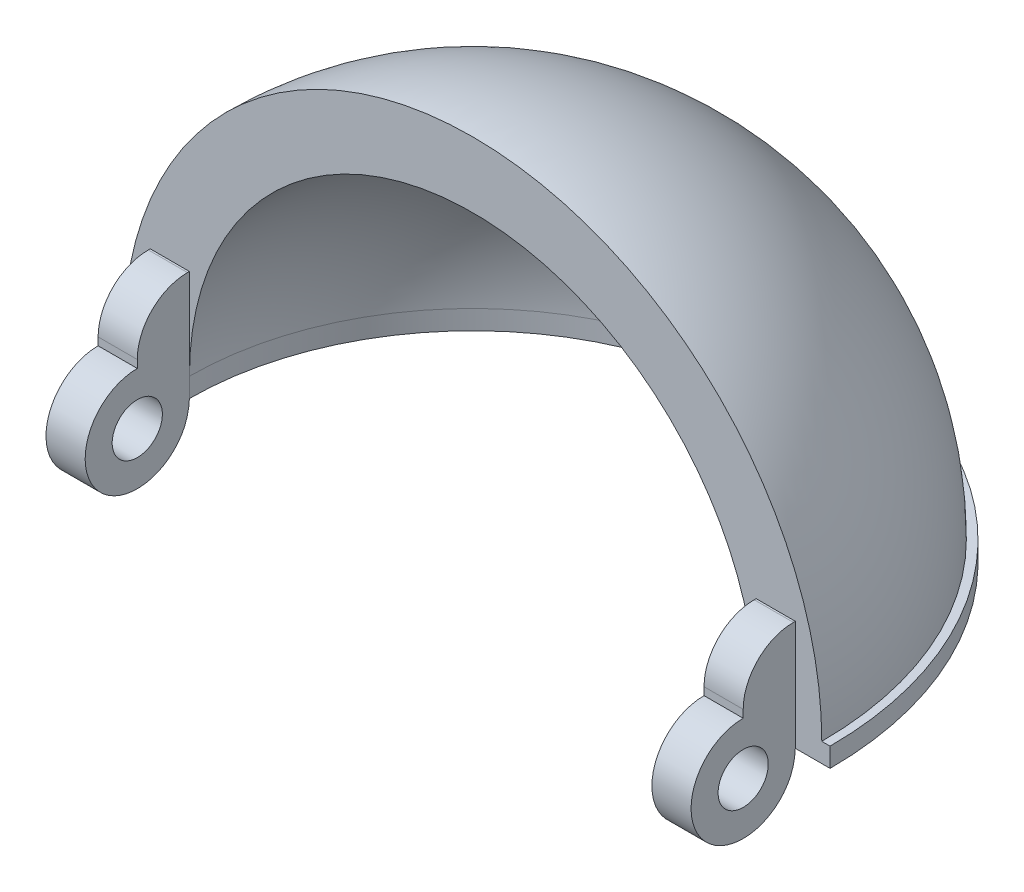
ISO-10303-21;
HEADER;
FILE_DESCRIPTION(('STEP AP214'),'2;1');
FILE_NAME('part.step','',(''),(''),'','','');
FILE_SCHEMA(('AUTOMOTIVE_DESIGN { 1 0 10303 214 1 1 1 1 }'));
ENDSEC;
DATA;
#1=APPLICATION_CONTEXT('core data for automotive mechanical design processes');
#2=APPLICATION_PROTOCOL_DEFINITION('international standard','automotive_design',2000,#1);
#3=PRODUCT_CONTEXT('',#1,'mechanical');
#4=PRODUCT('Part','Part','',(#3));
#5=PRODUCT_RELATED_PRODUCT_CATEGORY('part','',(#4));
#6=PRODUCT_DEFINITION_FORMATION('','',#4);
#7=PRODUCT_DEFINITION_CONTEXT('part definition',#1,'design');
#8=PRODUCT_DEFINITION('design','',#6,#7);
#9=PRODUCT_DEFINITION_SHAPE('','',#8);
#10=(LENGTH_UNIT() NAMED_UNIT(*) SI_UNIT(.MILLI.,.METRE.));
#11=(NAMED_UNIT(*) PLANE_ANGLE_UNIT() SI_UNIT($,.RADIAN.));
#12=(NAMED_UNIT(*) SI_UNIT($,.STERADIAN.) SOLID_ANGLE_UNIT());
#13=UNCERTAINTY_MEASURE_WITH_UNIT(LENGTH_MEASURE(1.E-05),#10,'distance_accuracy_value','');
#14=(GEOMETRIC_REPRESENTATION_CONTEXT(3) GLOBAL_UNCERTAINTY_ASSIGNED_CONTEXT((#13)) GLOBAL_UNIT_ASSIGNED_CONTEXT((#10,
#11,#12)) REPRESENTATION_CONTEXT('',''));
#15=CARTESIAN_POINT('',(0.,0.,0.));
#16=DIRECTION('',(0.,0.,1.));
#17=DIRECTION('',(1.,0.,0.));
#18=AXIS2_PLACEMENT_3D('',#15,#16,#17);
#19=CARTESIAN_POINT('',(-16.1602681796989,3.93657637130622,0.126576371306225));
#20=DIRECTION('',(1.,0.,0.));
#21=DIRECTION('',(0.,0.,-1.));
#22=AXIS2_PLACEMENT_3D('',#19,#20,#21);
#23=CYLINDRICAL_SURFACE('',#22,3.302);
#24=DIRECTION('',(-1.,0.,0.));
#25=VECTOR('',#24,1.);
#26=CARTESIAN_POINT('',(-16.1602681796989,3.93657637130622,3.42857637130622));
#27=LINE('',#26,#25);
#28=CARTESIAN_POINT('',(-13.5836555670863,3.93657637130622,3.42857637130622));
#29=VERTEX_POINT('',#28);
#30=CARTESIAN_POINT('',(-16.1602681796989,3.93657637130622,3.42857637130622));
#31=VERTEX_POINT('',#30);
#32=EDGE_CURVE('E258',#29,#31,#27,.T.);
#33=ORIENTED_EDGE('',*,*,#32,.F.);
#34=CARTESIAN_POINT('',(-13.5836555670863,3.93657637130622,0.126576371306225));
#35=DIRECTION('',(1.,0.,0.));
#36=DIRECTION('',(0.,0.,-1.));
#37=AXIS2_PLACEMENT_3D('',#34,#35,#36);
#38=CIRCLE('',#37,3.302);
#39=CARTESIAN_POINT('',(-13.5836555670863,7.23857637130622,0.126576371306224));
#40=VERTEX_POINT('',#39);
#41=EDGE_CURVE('E42',#40,#29,#38,.T.);
#42=ORIENTED_EDGE('',*,*,#41,.F.);
#43=DIRECTION('',(-1.,0.,0.));
#44=VECTOR('',#43,1.);
#45=CARTESIAN_POINT('',(-16.1602681796989,7.23857637130622,0.126576371306225));
#46=LINE('',#45,#44);
#47=CARTESIAN_POINT('',(-16.1602681796989,7.23857637130622,0.126576371306224));
#48=VERTEX_POINT('',#47);
#49=EDGE_CURVE('E260',#48,#40,#46,.F.);
#50=ORIENTED_EDGE('',*,*,#49,.F.);
#51=CARTESIAN_POINT('',(-16.1602681796989,3.93657637130622,0.126576371306225));
#52=DIRECTION('',(1.,0.,0.));
#53=DIRECTION('',(0.,0.,-1.));
#54=AXIS2_PLACEMENT_3D('',#51,#52,#53);
#55=CIRCLE('',#54,3.302);
#56=EDGE_CURVE('E11',#31,#48,#55,.F.);
#57=ORIENTED_EDGE('',*,*,#56,.F.);
#58=EDGE_LOOP('',(#33,#42,#50,#57));
#59=FACE_BOUND('',#58,.T.);
#60=ADVANCED_FACE('F35',(#59),#23,.T.);
#61=CARTESIAN_POINT('',(0.,3.93657637130622,0.126576371306225));
#62=DIRECTION('',(-1.,0.,0.));
#63=DIRECTION('',(0.,0.,1.));
#64=AXIS2_PLACEMENT_3D('',#61,#62,#63);
#65=CYLINDRICAL_SURFACE('',#64,3.302);
#66=DIRECTION('',(1.,0.,0.));
#67=VECTOR('',#66,1.);
#68=CARTESIAN_POINT('',(0.,7.23857637130622,0.126576371306225));
#69=LINE('',#68,#67);
#70=CARTESIAN_POINT('',(23.6963744629437,7.23857637130622,0.126576371306224));
#71=VERTEX_POINT('',#70);
#72=CARTESIAN_POINT('',(26.2729870755564,7.23857637130622,0.126576371306224));
#73=VERTEX_POINT('',#72);
#74=EDGE_CURVE('E248',#71,#73,#69,.T.);
#75=ORIENTED_EDGE('',*,*,#74,.F.);
#76=CARTESIAN_POINT('',(23.6963744629438,3.93657637130622,0.126576371306225));
#77=DIRECTION('',(-1.,0.,0.));
#78=DIRECTION('',(0.,0.,1.));
#79=AXIS2_PLACEMENT_3D('',#76,#77,#78);
#80=CIRCLE('',#79,3.302);
#81=CARTESIAN_POINT('',(23.6963744629437,3.93657637130622,3.42857637130622));
#82=VERTEX_POINT('',#81);
#83=EDGE_CURVE('E254',#82,#71,#80,.T.);
#84=ORIENTED_EDGE('',*,*,#83,.F.);
#85=DIRECTION('',(1.,0.,0.));
#86=VECTOR('',#85,1.);
#87=CARTESIAN_POINT('',(0.,3.93657637130622,3.42857637130622));
#88=LINE('',#87,#86);
#89=CARTESIAN_POINT('',(26.2729870755564,3.93657637130622,3.42857637130622));
#90=VERTEX_POINT('',#89);
#91=EDGE_CURVE('E251',#90,#82,#88,.F.);
#92=ORIENTED_EDGE('',*,*,#91,.F.);
#93=CARTESIAN_POINT('',(26.2729870755564,3.93657637130622,0.126576371306225));
#94=DIRECTION('',(-1.,0.,0.));
#95=DIRECTION('',(0.,0.,1.));
#96=AXIS2_PLACEMENT_3D('',#93,#94,#95);
#97=CIRCLE('',#96,3.302);
#98=EDGE_CURVE('E256',#73,#90,#97,.F.);
#99=ORIENTED_EDGE('',*,*,#98,.F.);
#100=EDGE_LOOP('',(#75,#84,#92,#99));
#101=FACE_BOUND('',#100,.T.);
#102=ADVANCED_FACE('F301',(#101),#65,.T.);
#103=CARTESIAN_POINT('',(23.6963744629438,1.27,0.));
#104=DIRECTION('',(0.,0.,-1.));
#105=DIRECTION('',(-1.,0.,0.));
#106=AXIS2_PLACEMENT_3D('',#103,#104,#105);
#107=PLANE('',#106);
#108=DIRECTION('',(0.,1.,0.));
#109=VECTOR('',#108,1.);
#110=CARTESIAN_POINT('',(-16.1602681796989,-50.292,0.));
#111=LINE('',#110,#109);
#112=CARTESIAN_POINT('',(-16.1602681796989,0.,0.));
#113=VERTEX_POINT('',#112);
#114=CARTESIAN_POINT('',(-16.1602681796989,7.23857637130622,0.));
#115=VERTEX_POINT('',#114);
#116=EDGE_CURVE('E187',#113,#115,#111,.T.);
#117=ORIENTED_EDGE('',*,*,#116,.T.);
#118=DIRECTION('',(-1.,0.,0.));
#119=VECTOR('',#118,1.);
#120=CARTESIAN_POINT('',(-16.1602681796989,7.23857637130622,0.));
#121=LINE('',#120,#119);
#122=CARTESIAN_POINT('',(-13.5836555670863,7.23857637130622,0.));
#123=VERTEX_POINT('',#122);
#124=EDGE_CURVE('E157',#123,#115,#121,.T.);
#125=ORIENTED_EDGE('',*,*,#124,.F.);
#126=DIRECTION('',(0.,1.,0.));
#127=VECTOR('',#126,1.);
#128=CARTESIAN_POINT('',(-13.5836555670863,-5.08,1.29236898960272E-13));
#129=LINE('',#128,#127);
#130=CARTESIAN_POINT('',(-13.5836555670863,1.27,1.29236898960272E-13));
#131=VERTEX_POINT('',#130);
#132=EDGE_CURVE('E211',#131,#123,#129,.T.);
#133=ORIENTED_EDGE('',*,*,#132,.F.);
#134=CARTESIAN_POINT('',(5.05635944792873,1.26999999999994,0.));
#135=DIRECTION('',(0.,0.,-1.));
#136=DIRECTION('',(0.,1.,0.));
#137=AXIS2_PLACEMENT_3D('',#134,#135,#136);
#138=CIRCLE('',#137,18.640015015015);
#139=CARTESIAN_POINT('',(23.6963744629438,1.27,0.));
#140=VERTEX_POINT('',#139);
#141=EDGE_CURVE('E225',#131,#140,#138,.T.);
#142=ORIENTED_EDGE('',*,*,#141,.T.);
#143=DIRECTION('',(0.,1.,0.));
#144=VECTOR('',#143,1.);
#145=CARTESIAN_POINT('',(23.6963744629438,-5.08,0.));
#146=LINE('',#145,#144);
#147=CARTESIAN_POINT('',(23.6963744629437,7.23857637130622,0.));
#148=VERTEX_POINT('',#147);
#149=EDGE_CURVE('E202',#140,#148,#146,.T.);
#150=ORIENTED_EDGE('',*,*,#149,.T.);
#151=DIRECTION('',(-1.,0.,0.));
#152=VECTOR('',#151,1.);
#153=CARTESIAN_POINT('',(23.6963744629437,7.23857637130622,0.));
#154=LINE('',#153,#152);
#155=CARTESIAN_POINT('',(26.2729870755564,7.23857637130622,0.));
#156=VERTEX_POINT('',#155);
#157=EDGE_CURVE('E279',#156,#148,#154,.T.);
#158=ORIENTED_EDGE('',*,*,#157,.F.);
#159=DIRECTION('',(0.,1.,0.));
#160=VECTOR('',#159,1.);
#161=CARTESIAN_POINT('',(26.2729870755564,-50.292,0.));
#162=LINE('',#161,#160);
#163=CARTESIAN_POINT('',(26.2729870755564,0.,0.));
#164=VERTEX_POINT('',#163);
#165=EDGE_CURVE('E190',#164,#156,#162,.T.);
#166=ORIENTED_EDGE('',*,*,#165,.F.);
#167=DIRECTION('',(1.,0.,0.));
#168=VECTOR('',#167,1.);
#169=CARTESIAN_POINT('',(5.05635944792873,0.,0.));
#170=LINE('',#169,#168);
#171=CARTESIAN_POINT('',(28.5589870755564,0.,0.));
#172=VERTEX_POINT('',#171);
#173=EDGE_CURVE('E194',#164,#172,#170,.T.);
#174=ORIENTED_EDGE('',*,*,#173,.T.);
#175=DIRECTION('',(0.,-1.,0.));
#176=VECTOR('',#175,1.);
#177=CARTESIAN_POINT('',(28.5589870755564,1.27,0.));
#178=LINE('',#177,#176);
#179=CARTESIAN_POINT('',(28.5589870755564,1.27,0.));
#180=VERTEX_POINT('',#179);
#181=EDGE_CURVE('E332',#180,#172,#178,.T.);
#182=ORIENTED_EDGE('',*,*,#181,.F.);
#183=DIRECTION('',(1.,0.,0.));
#184=VECTOR('',#183,1.);
#185=CARTESIAN_POINT('',(5.05635944792873,1.27,0.));
#186=LINE('',#185,#184);
#187=CARTESIAN_POINT('',(28.0143744629438,1.27,0.));
#188=VERTEX_POINT('',#187);
#189=EDGE_CURVE('E204',#188,#180,#186,.T.);
#190=ORIENTED_EDGE('',*,*,#189,.F.);
#191=CARTESIAN_POINT('',(5.05635944792873,1.27,0.));
#192=DIRECTION('',(0.,0.,1.));
#193=DIRECTION('',(0.,1.,0.));
#194=AXIS2_PLACEMENT_3D('',#191,#192,#193);
#195=CIRCLE('',#194,22.958015015015);
#196=CARTESIAN_POINT('',(-17.9016555670863,1.27,0.));
#197=VERTEX_POINT('',#196);
#198=EDGE_CURVE('E233',#188,#197,#195,.T.);
#199=ORIENTED_EDGE('',*,*,#198,.T.);
#200=DIRECTION('',(1.,0.,0.));
#201=VECTOR('',#200,1.);
#202=CARTESIAN_POINT('',(5.05635944792873,1.27,1.29236898960272E-13));
#203=LINE('',#202,#201);
#204=CARTESIAN_POINT('',(-18.4462681796989,1.27,1.29236898960272E-13));
#205=VERTEX_POINT('',#204);
#206=EDGE_CURVE('E219',#205,#197,#203,.T.);
#207=ORIENTED_EDGE('',*,*,#206,.F.);
#208=DIRECTION('',(0.,-1.,0.));
#209=VECTOR('',#208,1.);
#210=CARTESIAN_POINT('',(-18.4462681796989,1.27,0.));
#211=LINE('',#210,#209);
#212=CARTESIAN_POINT('',(-18.4462681796989,0.,1.29236898960272E-13));
#213=VERTEX_POINT('',#212);
#214=EDGE_CURVE('E231',#205,#213,#211,.T.);
#215=ORIENTED_EDGE('',*,*,#214,.T.);
#216=DIRECTION('',(1.,0.,0.));
#217=VECTOR('',#216,1.);
#218=CARTESIAN_POINT('',(5.05635944792873,0.,1.29236898960272E-13));
#219=LINE('',#218,#217);
#220=EDGE_CURVE('E217',#213,#113,#219,.T.);
#221=ORIENTED_EDGE('',*,*,#220,.T.);
#222=EDGE_LOOP('',(#117,#125,#133,#142,#150,#158,#166,#174,#182,#190,#199,#207,#215,#221));
#223=FACE_BOUND('',#222,.T.);
#224=ADVANCED_FACE('F316',(#223),#107,.F.);
#225=CARTESIAN_POINT('',(-13.5836555670863,0.,7.93553007849928));
#226=DIRECTION('',(1.,0.,0.));
#227=DIRECTION('',(0.,0.,-1.));
#228=AXIS2_PLACEMENT_3D('',#225,#226,#227);
#229=PLANE('',#228);
#230=DIRECTION('',(0.,0.,-1.));
#231=VECTOR('',#230,1.);
#232=CARTESIAN_POINT('',(-13.5836555670863,7.23857637130622,0.));
#233=LINE('',#232,#231);
#234=EDGE_CURVE('E265',#40,#123,#233,.T.);
#235=ORIENTED_EDGE('',*,*,#234,.F.);
#236=ORIENTED_EDGE('',*,*,#41,.T.);
#237=DIRECTION('',(0.,-1.,0.));
#238=VECTOR('',#237,1.);
#239=CARTESIAN_POINT('',(-13.5836555670863,7.23857637130622,3.42857637130622));
#240=LINE('',#239,#238);
#241=CARTESIAN_POINT('',(-13.5836555670863,3.42857637130622,3.42857637130622));
#242=VERTEX_POINT('',#241);
#243=EDGE_CURVE('E145',#29,#242,#240,.T.);
#244=ORIENTED_EDGE('',*,*,#243,.T.);
#245=CARTESIAN_POINT('',(-13.5836555670863,0.,3.42857637130622));
#246=DIRECTION('',(1.,0.,0.));
#247=DIRECTION('',(0.,0.,-1.));
#248=AXIS2_PLACEMENT_3D('',#245,#246,#247);
#249=CIRCLE('',#248,3.42857637130622);
#250=CARTESIAN_POINT('',(-13.5836555670863,-1.45003654551441,0.321724274641177));
#251=VERTEX_POINT('',#250);
#252=EDGE_CURVE('E151',#251,#242,#249,.F.);
#253=ORIENTED_EDGE('',*,*,#252,.F.);
#254=CARTESIAN_POINT('',(-13.5836555670863,0.125912777106715,3.99607513575469));
#255=DIRECTION('',(1.,0.,0.));
#256=DIRECTION('',(0.,0.,-1.));
#257=AXIS2_PLACEMENT_3D('',#254,#255,#256);
#258=CIRCLE('',#257,3.99805834350071);
#259=CARTESIAN_POINT('',(-13.5836555670863,0.,0.));
#260=VERTEX_POINT('',#259);
#261=EDGE_CURVE('E185',#260,#251,#258,.F.);
#262=ORIENTED_EDGE('',*,*,#261,.F.);
#263=DIRECTION('',(0.,-1.,0.));
#264=VECTOR('',#263,1.);
#265=CARTESIAN_POINT('',(-13.5836555670863,1.27,1.29236898960272E-13));
#266=LINE('',#265,#264);
#267=EDGE_CURVE('E339',#131,#260,#266,.T.);
#268=ORIENTED_EDGE('',*,*,#267,.F.);
#269=ORIENTED_EDGE('',*,*,#132,.T.);
#270=EDGE_LOOP('',(#235,#236,#244,#253,#262,#268,#269));
#271=FACE_BOUND('',#270,.T.);
#272=CARTESIAN_POINT('',(-13.5836555670863,0.,3.42857637130622));
#273=DIRECTION('',(1.,0.,0.));
#274=DIRECTION('',(0.,0.,-1.));
#275=AXIS2_PLACEMENT_3D('',#272,#273,#274);
#276=CIRCLE('',#275,1.651);
#277=CARTESIAN_POINT('',(-13.5836555670863,0.,1.77757637130622));
#278=VERTEX_POINT('',#277);
#279=EDGE_CURVE('E199',#278,#278,#276,.T.);
#280=ORIENTED_EDGE('',*,*,#279,.F.);
#281=EDGE_LOOP('',(#280));
#282=FACE_BOUND('',#281,.T.);
#283=ADVANCED_FACE('F148',(#271,#282),#229,.T.);
#284=CARTESIAN_POINT('',(23.6963744629438,0.,7.93553007849928));
#285=DIRECTION('',(-1.,0.,0.));
#286=DIRECTION('',(0.,0.,1.));
#287=AXIS2_PLACEMENT_3D('',#284,#285,#286);
#288=PLANE('',#287);
#289=DIRECTION('',(0.,-1.,0.));
#290=VECTOR('',#289,1.);
#291=CARTESIAN_POINT('',(23.6963744629437,7.23857637130622,3.42857637130622));
#292=LINE('',#291,#290);
#293=CARTESIAN_POINT('',(23.6963744629437,3.42857637130622,3.42857637130622));
#294=VERTEX_POINT('',#293);
#295=EDGE_CURVE('E283',#82,#294,#292,.T.);
#296=ORIENTED_EDGE('',*,*,#295,.F.);
#297=ORIENTED_EDGE('',*,*,#83,.T.);
#298=DIRECTION('',(0.,0.,1.));
#299=VECTOR('',#298,1.);
#300=CARTESIAN_POINT('',(23.6963744629437,7.23857637130622,0.));
#301=LINE('',#300,#299);
#302=EDGE_CURVE('E274',#148,#71,#301,.T.);
#303=ORIENTED_EDGE('',*,*,#302,.F.);
#304=ORIENTED_EDGE('',*,*,#149,.F.);
#305=DIRECTION('',(0.,-1.,0.));
#306=VECTOR('',#305,1.);
#307=CARTESIAN_POINT('',(23.6963744629438,1.27,0.));
#308=LINE('',#307,#306);
#309=CARTESIAN_POINT('',(23.6963744629438,0.,0.));
#310=VERTEX_POINT('',#309);
#311=EDGE_CURVE('E336',#140,#310,#308,.T.);
#312=ORIENTED_EDGE('',*,*,#311,.T.);
#313=CARTESIAN_POINT('',(23.6963744629438,0.125912777106715,3.99607513575469));
#314=DIRECTION('',(-1.,0.,0.));
#315=DIRECTION('',(0.,0.,1.));
#316=AXIS2_PLACEMENT_3D('',#313,#314,#315);
#317=CIRCLE('',#316,3.99805834350071);
#318=CARTESIAN_POINT('',(23.6963744629438,-1.45003654551441,0.321724274641177));
#319=VERTEX_POINT('',#318);
#320=EDGE_CURVE('E183',#319,#310,#317,.F.);
#321=ORIENTED_EDGE('',*,*,#320,.F.);
#322=CARTESIAN_POINT('',(23.6963744629438,0.,3.42857637130622));
#323=DIRECTION('',(-1.,0.,0.));
#324=DIRECTION('',(0.,0.,1.));
#325=AXIS2_PLACEMENT_3D('',#322,#323,#324);
#326=CIRCLE('',#325,3.42857637130622);
#327=EDGE_CURVE('E170',#294,#319,#326,.F.);
#328=ORIENTED_EDGE('',*,*,#327,.F.);
#329=EDGE_LOOP('',(#296,#297,#303,#304,#312,#321,#328));
#330=FACE_BOUND('',#329,.T.);
#331=CARTESIAN_POINT('',(23.6963744629438,0.,3.42857637130622));
#332=DIRECTION('',(-1.,0.,0.));
#333=DIRECTION('',(0.,0.,1.));
#334=AXIS2_PLACEMENT_3D('',#331,#332,#333);
#335=CIRCLE('',#334,1.651);
#336=CARTESIAN_POINT('',(23.6963744629438,0.,5.07957637130622));
#337=VERTEX_POINT('',#336);
#338=EDGE_CURVE('E196',#337,#337,#335,.T.);
#339=ORIENTED_EDGE('',*,*,#338,.F.);
#340=EDGE_LOOP('',(#339));
#341=FACE_BOUND('',#340,.T.);
#342=ADVANCED_FACE('F304',(#330,#341),#288,.T.);
#343=CARTESIAN_POINT('',(26.2729870755564,-50.292,0.));
#344=DIRECTION('',(-1.,0.,0.));
#345=DIRECTION('',(0.,0.,1.));
#346=AXIS2_PLACEMENT_3D('',#343,#344,#345);
#347=PLANE('',#346);
#348=CARTESIAN_POINT('',(26.2729870755564,0.,3.42857637130622));
#349=DIRECTION('',(-1.,0.,0.));
#350=DIRECTION('',(0.,0.,1.));
#351=AXIS2_PLACEMENT_3D('',#348,#349,#350);
#352=CIRCLE('',#351,1.651);
#353=CARTESIAN_POINT('',(26.2729870755564,0.,5.07957637130622));
#354=VERTEX_POINT('',#353);
#355=EDGE_CURVE('E193',#354,#354,#352,.F.);
#356=ORIENTED_EDGE('',*,*,#355,.F.);
#357=EDGE_LOOP('',(#356));
#358=FACE_BOUND('',#357,.T.);
#359=DIRECTION('',(0.,0.,-1.));
#360=VECTOR('',#359,1.);
#361=CARTESIAN_POINT('',(26.2729870755564,7.23857637130622,0.));
#362=LINE('',#361,#360);
#363=EDGE_CURVE('E277',#73,#156,#362,.T.);
#364=ORIENTED_EDGE('',*,*,#363,.F.);
#365=ORIENTED_EDGE('',*,*,#98,.T.);
#366=DIRECTION('',(0.,-1.,0.));
#367=VECTOR('',#366,1.);
#368=CARTESIAN_POINT('',(26.2729870755564,7.23857637130622,3.42857637130622));
#369=LINE('',#368,#367);
#370=CARTESIAN_POINT('',(26.2729870755564,3.42857637130622,3.42857637130622));
#371=VERTEX_POINT('',#370);
#372=EDGE_CURVE('E282',#90,#371,#369,.T.);
#373=ORIENTED_EDGE('',*,*,#372,.T.);
#374=CARTESIAN_POINT('',(26.2729870755564,0.,3.42857637130622));
#375=DIRECTION('',(-1.,0.,0.));
#376=DIRECTION('',(0.,0.,-1.));
#377=AXIS2_PLACEMENT_3D('',#374,#375,#376);
#378=CIRCLE('',#377,3.42857637130622);
#379=CARTESIAN_POINT('',(26.2729870755564,-1.45003654551441,0.321724274641178));
#380=VERTEX_POINT('',#379);
#381=EDGE_CURVE('E175',#380,#371,#378,.T.);
#382=ORIENTED_EDGE('',*,*,#381,.F.);
#383=CARTESIAN_POINT('',(26.2729870755564,0.125912777106715,3.99607513575469));
#384=DIRECTION('',(-1.,0.,0.));
#385=DIRECTION('',(0.,0.,1.));
#386=AXIS2_PLACEMENT_3D('',#383,#384,#385);
#387=CIRCLE('',#386,3.99805834350071);
#388=EDGE_CURVE('E166',#164,#380,#387,.T.);
#389=ORIENTED_EDGE('',*,*,#388,.F.);
#390=ORIENTED_EDGE('',*,*,#165,.T.);
#391=EDGE_LOOP('',(#364,#365,#373,#382,#389,#390));
#392=FACE_BOUND('',#391,.T.);
#393=ADVANCED_FACE('F298',(#358,#392),#347,.F.);
#394=CARTESIAN_POINT('',(-16.1602681796989,-50.292,0.));
#395=DIRECTION('',(1.,0.,0.));
#396=DIRECTION('',(0.,0.,-1.));
#397=AXIS2_PLACEMENT_3D('',#394,#395,#396);
#398=PLANE('',#397);
#399=CARTESIAN_POINT('',(-16.1602681796989,0.,3.42857637130622));
#400=DIRECTION('',(1.,0.,0.));
#401=DIRECTION('',(0.,0.,-1.));
#402=AXIS2_PLACEMENT_3D('',#399,#400,#401);
#403=CIRCLE('',#402,1.651);
#404=CARTESIAN_POINT('',(-16.1602681796989,0.,1.77757637130622));
#405=VERTEX_POINT('',#404);
#406=EDGE_CURVE('E189',#405,#405,#403,.F.);
#407=ORIENTED_EDGE('',*,*,#406,.F.);
#408=EDGE_LOOP('',(#407));
#409=FACE_BOUND('',#408,.T.);
#410=DIRECTION('',(0.,-1.,0.));
#411=VECTOR('',#410,1.);
#412=CARTESIAN_POINT('',(-16.1602681796989,7.23857637130622,3.42857637130622));
#413=LINE('',#412,#411);
#414=CARTESIAN_POINT('',(-16.1602681796989,3.42857637130622,3.42857637130622));
#415=VERTEX_POINT('',#414);
#416=EDGE_CURVE('E156',#31,#415,#413,.T.);
#417=ORIENTED_EDGE('',*,*,#416,.F.);
#418=ORIENTED_EDGE('',*,*,#56,.T.);
#419=DIRECTION('',(0.,0.,1.));
#420=VECTOR('',#419,1.);
#421=CARTESIAN_POINT('',(-16.1602681796989,7.23857637130622,0.));
#422=LINE('',#421,#420);
#423=EDGE_CURVE('E266',#115,#48,#422,.T.);
#424=ORIENTED_EDGE('',*,*,#423,.F.);
#425=ORIENTED_EDGE('',*,*,#116,.F.);
#426=CARTESIAN_POINT('',(-16.1602681796989,0.125912777106715,3.99607513575469));
#427=DIRECTION('',(1.,0.,0.));
#428=DIRECTION('',(0.,0.,-1.));
#429=AXIS2_PLACEMENT_3D('',#426,#427,#428);
#430=CIRCLE('',#429,3.99805834350071);
#431=CARTESIAN_POINT('',(-16.1602681796989,-1.45003654551441,0.321724274641177));
#432=VERTEX_POINT('',#431);
#433=EDGE_CURVE('E242',#113,#432,#430,.F.);
#434=ORIENTED_EDGE('',*,*,#433,.T.);
#435=CARTESIAN_POINT('',(-16.1602681796989,0.,3.42857637130622));
#436=DIRECTION('',(1.,0.,0.));
#437=DIRECTION('',(0.,0.,-1.));
#438=AXIS2_PLACEMENT_3D('',#435,#436,#437);
#439=CIRCLE('',#438,3.42857637130622);
#440=EDGE_CURVE('E167',#432,#415,#439,.F.);
#441=ORIENTED_EDGE('',*,*,#440,.T.);
#442=EDGE_LOOP('',(#417,#418,#424,#425,#434,#441));
#443=FACE_BOUND('',#442,.T.);
#444=ADVANCED_FACE('F369',(#409,#443),#398,.F.);
#445=CARTESIAN_POINT('',(5.05635944792873,1.27,1.29237061760828E-13));
#446=DIRECTION('',(0.,-1.,0.));
#447=DIRECTION('',(0.,0.,-1.));
#448=AXIS2_PLACEMENT_3D('',#445,#446,#447);
#449=CYLINDRICAL_SURFACE('',#448,23.5026276276276);
#450=CARTESIAN_POINT('',(5.05635944792873,0.,1.29237061760828E-13));
#451=DIRECTION('',(0.,1.,0.));
#452=DIRECTION('',(0.,0.,-1.));
#453=AXIS2_PLACEMENT_3D('',#450,#451,#452);
#454=CIRCLE('',#453,23.5026276276276);
#455=EDGE_CURVE('E235',#172,#213,#454,.T.);
#456=ORIENTED_EDGE('',*,*,#455,.T.);
#457=ORIENTED_EDGE('',*,*,#214,.F.);
#458=CARTESIAN_POINT('',(5.05635944792873,1.27,1.29237061760828E-13));
#459=DIRECTION('',(0.,1.,0.));
#460=DIRECTION('',(0.,0.,-1.));
#461=AXIS2_PLACEMENT_3D('',#458,#459,#460);
#462=CIRCLE('',#461,23.5026276276276);
#463=EDGE_CURVE('E335',#180,#205,#462,.T.);
#464=ORIENTED_EDGE('',*,*,#463,.F.);
#465=ORIENTED_EDGE('',*,*,#181,.T.);
#466=EDGE_LOOP('',(#456,#457,#464,#465));
#467=FACE_BOUND('',#466,.T.);
#468=ADVANCED_FACE('F333',(#467),#449,.T.);
#469=CARTESIAN_POINT('',(5.05635944792873,1.27,0.));
#470=DIRECTION('',(0.,-1.,0.));
#471=DIRECTION('',(0.,0.,-1.));
#472=AXIS2_PLACEMENT_3D('',#469,#470,#471);
#473=CYLINDRICAL_SURFACE('',#472,18.640015015015);
#474=CARTESIAN_POINT('',(5.05635944792873,0.,0.));
#475=DIRECTION('',(0.,-1.,0.));
#476=DIRECTION('',(0.,0.,-1.));
#477=AXIS2_PLACEMENT_3D('',#474,#475,#476);
#478=CIRCLE('',#477,18.640015015015);
#479=EDGE_CURVE('E329',#260,#310,#478,.T.);
#480=ORIENTED_EDGE('',*,*,#479,.T.);
#481=ORIENTED_EDGE('',*,*,#311,.F.);
#482=CARTESIAN_POINT('',(5.05635944792873,1.27,0.));
#483=DIRECTION('',(0.,-1.,0.));
#484=DIRECTION('',(0.,0.,-1.));
#485=AXIS2_PLACEMENT_3D('',#482,#483,#484);
#486=CIRCLE('',#485,18.640015015015);
#487=EDGE_CURVE('E337',#131,#140,#486,.T.);
#488=ORIENTED_EDGE('',*,*,#487,.F.);
#489=ORIENTED_EDGE('',*,*,#267,.T.);
#490=EDGE_LOOP('',(#480,#481,#488,#489));
#491=FACE_BOUND('',#490,.T.);
#492=ADVANCED_FACE('F353',(#491),#473,.F.);
#493=CARTESIAN_POINT('',(5.05635944792873,1.27,1.29237061760828E-13));
#494=DIRECTION('',(0.,-1.,0.));
#495=DIRECTION('',(0.,0.,-1.));
#496=AXIS2_PLACEMENT_3D('',#493,#494,#495);
#497=PLANE('',#496);
#498=CARTESIAN_POINT('',(5.05635944792873,1.27,0.));
#499=DIRECTION('',(0.,1.,0.));
#500=DIRECTION('',(0.,0.,-1.));
#501=AXIS2_PLACEMENT_3D('',#498,#499,#500);
#502=CIRCLE('',#501,22.958015015015);
#503=EDGE_CURVE('E222',#188,#197,#502,.T.);
#504=ORIENTED_EDGE('',*,*,#503,.F.);
#505=ORIENTED_EDGE('',*,*,#189,.T.);
#506=ORIENTED_EDGE('',*,*,#463,.T.);
#507=ORIENTED_EDGE('',*,*,#206,.T.);
#508=EDGE_LOOP('',(#504,#505,#506,#507));
#509=FACE_BOUND('',#508,.T.);
#510=ADVANCED_FACE('F351',(#509),#497,.F.);
#511=CARTESIAN_POINT('',(5.05635944792873,0.,1.29237061760828E-13));
#512=DIRECTION('',(0.,-1.,0.));
#513=DIRECTION('',(0.,0.,-1.));
#514=AXIS2_PLACEMENT_3D('',#511,#512,#513);
#515=PLANE('',#514);
#516=DIRECTION('',(1.,0.,0.));
#517=VECTOR('',#516,1.);
#518=CARTESIAN_POINT('',(5.05635944792873,0.,0.));
#519=LINE('',#518,#517);
#520=EDGE_CURVE('E207',#310,#164,#519,.T.);
#521=ORIENTED_EDGE('',*,*,#520,.F.);
#522=ORIENTED_EDGE('',*,*,#479,.F.);
#523=EDGE_CURVE('E214',#113,#260,#219,.T.);
#524=ORIENTED_EDGE('',*,*,#523,.F.);
#525=ORIENTED_EDGE('',*,*,#220,.F.);
#526=ORIENTED_EDGE('',*,*,#455,.F.);
#527=ORIENTED_EDGE('',*,*,#173,.F.);
#528=EDGE_LOOP('',(#521,#522,#524,#525,#526,#527));
#529=FACE_BOUND('',#528,.T.);
#530=ADVANCED_FACE('F319',(#529),#515,.T.);
#531=CARTESIAN_POINT('',(5.05635944792873,1.26999999999994,0.));
#532=DIRECTION('',(-1.,0.,0.));
#533=DIRECTION('',(0.,-1.,0.));
#534=AXIS2_PLACEMENT_3D('',#531,#532,#533);
#535=SPHERICAL_SURFACE('',#534,18.640015015015);
#536=ORIENTED_EDGE('',*,*,#487,.T.);
#537=ORIENTED_EDGE('',*,*,#141,.F.);
#538=EDGE_LOOP('',(#536,#537));
#539=FACE_BOUND('',#538,.T.);
#540=ADVANCED_FACE('F394',(#539),#535,.F.);
#541=CARTESIAN_POINT('',(5.05635944792873,1.27,0.));
#542=DIRECTION('',(-1.,0.,0.));
#543=DIRECTION('',(0.,1.,0.));
#544=AXIS2_PLACEMENT_3D('',#541,#542,#543);
#545=SPHERICAL_SURFACE('',#544,22.958015015015);
#546=ORIENTED_EDGE('',*,*,#503,.T.);
#547=ORIENTED_EDGE('',*,*,#198,.F.);
#548=EDGE_LOOP('',(#546,#547));
#549=FACE_BOUND('',#548,.T.);
#550=ADVANCED_FACE('F397',(#549),#545,.T.);
#551=CARTESIAN_POINT('',(36.9257318203011,0.,3.42857637130622));
#552=DIRECTION('',(-1.,0.,0.));
#553=DIRECTION('',(0.,0.,1.));
#554=AXIS2_PLACEMENT_3D('',#551,#552,#553);
#555=CYLINDRICAL_SURFACE('',#554,1.651);
#556=ORIENTED_EDGE('',*,*,#355,.T.);
#557=EDGE_LOOP('',(#556));
#558=FACE_BOUND('',#557,.T.);
#559=ORIENTED_EDGE('',*,*,#338,.T.);
#560=EDGE_LOOP('',(#559));
#561=FACE_BOUND('',#560,.T.);
#562=ADVANCED_FACE('F379',(#558,#561),#555,.F.);
#563=ORIENTED_EDGE('',*,*,#406,.T.);
#564=EDGE_LOOP('',(#563));
#565=FACE_BOUND('',#564,.T.);
#566=ORIENTED_EDGE('',*,*,#279,.T.);
#567=EDGE_LOOP('',(#566));
#568=FACE_BOUND('',#567,.T.);
#569=ADVANCED_FACE('F373',(#565,#568),#555,.F.);
#570=CARTESIAN_POINT('',(-29.0990129244436,0.125912777106715,3.99607513575469));
#571=DIRECTION('',(1.,0.,0.));
#572=DIRECTION('',(0.,0.,-1.));
#573=AXIS2_PLACEMENT_3D('',#570,#571,#572);
#574=CYLINDRICAL_SURFACE('',#573,3.99805834350071);
#575=ORIENTED_EDGE('',*,*,#261,.T.);
#576=DIRECTION('',(1.,0.,0.));
#577=VECTOR('',#576,1.);
#578=CARTESIAN_POINT('',(-1.66701292444364,-1.45003654551441,0.321724274641177));
#579=LINE('',#578,#577);
#580=EDGE_CURVE('E165',#251,#432,#579,.F.);
#581=ORIENTED_EDGE('',*,*,#580,.T.);
#582=ORIENTED_EDGE('',*,*,#433,.F.);
#583=ORIENTED_EDGE('',*,*,#523,.T.);
#584=EDGE_LOOP('',(#575,#581,#582,#583));
#585=FACE_BOUND('',#584,.T.);
#586=ADVANCED_FACE('F371',(#585),#574,.T.);
#587=ORIENTED_EDGE('',*,*,#388,.T.);
#588=DIRECTION('',(1.,0.,0.));
#589=VECTOR('',#588,1.);
#590=CARTESIAN_POINT('',(-1.66701292444364,-1.45003654551441,0.321724274641177));
#591=LINE('',#590,#589);
#592=EDGE_CURVE('E245',#380,#319,#591,.F.);
#593=ORIENTED_EDGE('',*,*,#592,.T.);
#594=ORIENTED_EDGE('',*,*,#320,.T.);
#595=ORIENTED_EDGE('',*,*,#520,.T.);
#596=EDGE_LOOP('',(#587,#593,#594,#595));
#597=FACE_BOUND('',#596,.T.);
#598=ADVANCED_FACE('F310',(#597),#574,.T.);
#599=CARTESIAN_POINT('',(-29.6070129244436,0.,3.42857637130622));
#600=DIRECTION('',(1.,0.,0.));
#601=DIRECTION('',(0.,0.,-1.));
#602=AXIS2_PLACEMENT_3D('',#599,#600,#601);
#603=CYLINDRICAL_SURFACE('',#602,3.42857637130622);
#604=ORIENTED_EDGE('',*,*,#327,.T.);
#605=ORIENTED_EDGE('',*,*,#592,.F.);
#606=ORIENTED_EDGE('',*,*,#381,.T.);
#607=DIRECTION('',(1.,0.,0.));
#608=VECTOR('',#607,1.);
#609=CARTESIAN_POINT('',(-29.6070129244436,3.42857637130622,3.42857637130622));
#610=LINE('',#609,#608);
#611=EDGE_CURVE('E171',#294,#371,#610,.T.);
#612=ORIENTED_EDGE('',*,*,#611,.F.);
#613=EDGE_LOOP('',(#604,#605,#606,#612));
#614=FACE_BOUND('',#613,.T.);
#615=ADVANCED_FACE('F290',(#614),#603,.T.);
#616=ORIENTED_EDGE('',*,*,#252,.T.);
#617=EDGE_CURVE('E162',#415,#242,#610,.T.);
#618=ORIENTED_EDGE('',*,*,#617,.F.);
#619=ORIENTED_EDGE('',*,*,#440,.F.);
#620=ORIENTED_EDGE('',*,*,#580,.F.);
#621=EDGE_LOOP('',(#616,#618,#619,#620));
#622=FACE_BOUND('',#621,.T.);
#623=ADVANCED_FACE('F161',(#622),#603,.T.);
#624=CARTESIAN_POINT('',(23.6963744629437,7.23857637130622,3.42857637130622));
#625=DIRECTION('',(0.,0.,-1.));
#626=DIRECTION('',(-1.,0.,0.));
#627=AXIS2_PLACEMENT_3D('',#624,#625,#626);
#628=PLANE('',#627);
#629=ORIENTED_EDGE('',*,*,#372,.F.);
#630=ORIENTED_EDGE('',*,*,#91,.T.);
#631=ORIENTED_EDGE('',*,*,#295,.T.);
#632=ORIENTED_EDGE('',*,*,#611,.T.);
#633=EDGE_LOOP('',(#629,#630,#631,#632));
#634=FACE_BOUND('',#633,.T.);
#635=ADVANCED_FACE('F295',(#634),#628,.F.);
#636=CARTESIAN_POINT('',(0.,7.23857637130622,0.));
#637=DIRECTION('',(0.,1.,0.));
#638=DIRECTION('',(0.,0.,1.));
#639=AXIS2_PLACEMENT_3D('',#636,#637,#638);
#640=PLANE('',#639);
#641=ORIENTED_EDGE('',*,*,#302,.T.);
#642=ORIENTED_EDGE('',*,*,#74,.T.);
#643=ORIENTED_EDGE('',*,*,#363,.T.);
#644=ORIENTED_EDGE('',*,*,#157,.T.);
#645=EDGE_LOOP('',(#641,#642,#643,#644));
#646=FACE_BOUND('',#645,.T.);
#647=ADVANCED_FACE('F356',(#646),#640,.T.);
#648=CARTESIAN_POINT('',(-16.1602681796989,7.23857637130622,3.42857637130622));
#649=DIRECTION('',(0.,0.,-1.));
#650=DIRECTION('',(-1.,0.,0.));
#651=AXIS2_PLACEMENT_3D('',#648,#649,#650);
#652=PLANE('',#651);
#653=ORIENTED_EDGE('',*,*,#243,.F.);
#654=ORIENTED_EDGE('',*,*,#32,.T.);
#655=ORIENTED_EDGE('',*,*,#416,.T.);
#656=ORIENTED_EDGE('',*,*,#617,.T.);
#657=EDGE_LOOP('',(#653,#654,#655,#656));
#658=FACE_BOUND('',#657,.T.);
#659=ADVANCED_FACE('F169',(#658),#652,.F.);
#660=CARTESIAN_POINT('',(0.,7.23857637130622,0.));
#661=DIRECTION('',(0.,1.,0.));
#662=DIRECTION('',(0.,0.,1.));
#663=AXIS2_PLACEMENT_3D('',#660,#661,#662);
#664=PLANE('',#663);
#665=ORIENTED_EDGE('',*,*,#423,.T.);
#666=ORIENTED_EDGE('',*,*,#49,.T.);
#667=ORIENTED_EDGE('',*,*,#234,.T.);
#668=ORIENTED_EDGE('',*,*,#124,.T.);
#669=EDGE_LOOP('',(#665,#666,#667,#668));
#670=FACE_BOUND('',#669,.T.);
#671=ADVANCED_FACE('F263',(#670),#664,.T.);
#672=CLOSED_SHELL('',(#60,#102,#224,#283,#342,#393,#444,#468,#492,#510,#530,#540,#550,#562,#569,
#586,#598,#615,#623,#635,#647,#659,#671));
#673=MANIFOLD_SOLID_BREP('B2',#672);
#674=ADVANCED_BREP_SHAPE_REPRESENTATION('',(#18,#673),#14);
#675=SHAPE_DEFINITION_REPRESENTATION(#9,#674);
ENDSEC;
END-ISO-10303-21;
